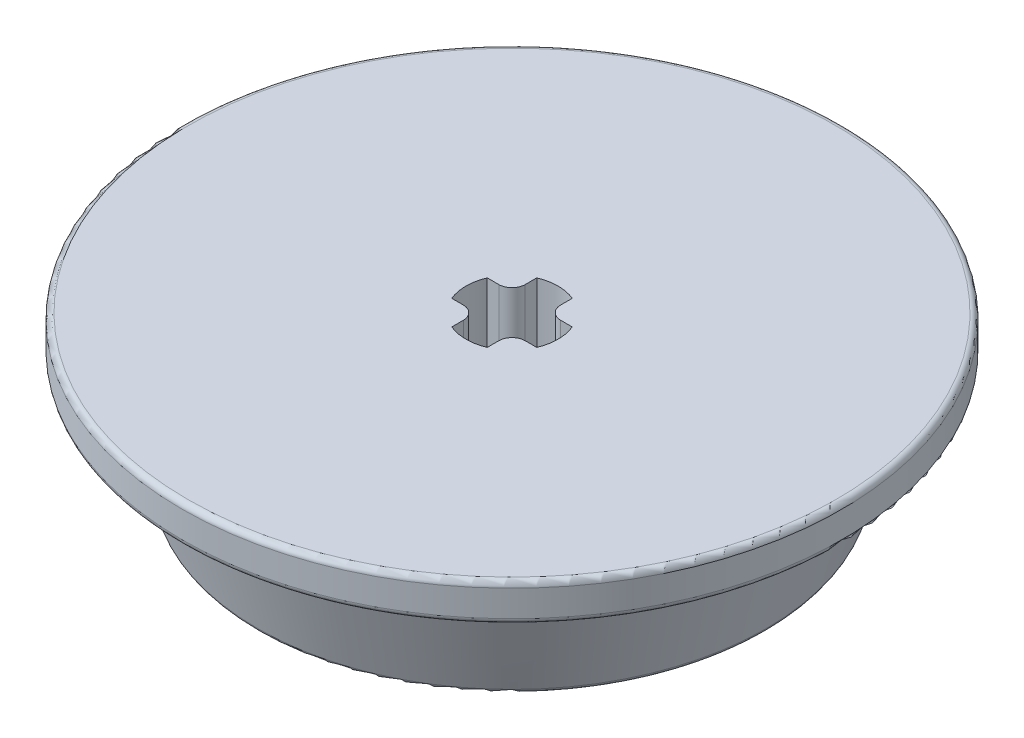
ISO-10303-21;
HEADER;
FILE_DESCRIPTION(('STEP AP214'),'2;1');
FILE_NAME('part.step','',(''),(''),'','','');
FILE_SCHEMA(('AUTOMOTIVE_DESIGN { 1 0 10303 214 1 1 1 1 }'));
ENDSEC;
DATA;
#1=APPLICATION_CONTEXT('core data for automotive mechanical design processes');
#2=APPLICATION_PROTOCOL_DEFINITION('international standard','automotive_design',2000,#1);
#3=PRODUCT_CONTEXT('',#1,'mechanical');
#4=PRODUCT('Part','Part','',(#3));
#5=PRODUCT_RELATED_PRODUCT_CATEGORY('part','',(#4));
#6=PRODUCT_DEFINITION_FORMATION('','',#4);
#7=PRODUCT_DEFINITION_CONTEXT('part definition',#1,'design');
#8=PRODUCT_DEFINITION('design','',#6,#7);
#9=PRODUCT_DEFINITION_SHAPE('','',#8);
#10=(LENGTH_UNIT() NAMED_UNIT(*) SI_UNIT(.MILLI.,.METRE.));
#11=(NAMED_UNIT(*) PLANE_ANGLE_UNIT() SI_UNIT($,.RADIAN.));
#12=(NAMED_UNIT(*) SI_UNIT($,.STERADIAN.) SOLID_ANGLE_UNIT());
#13=UNCERTAINTY_MEASURE_WITH_UNIT(LENGTH_MEASURE(1.E-05),#10,'distance_accuracy_value','');
#14=(GEOMETRIC_REPRESENTATION_CONTEXT(3) GLOBAL_UNCERTAINTY_ASSIGNED_CONTEXT((#13)) GLOBAL_UNIT_ASSIGNED_CONTEXT((#10,
#11,#12)) REPRESENTATION_CONTEXT('',''));
#15=CARTESIAN_POINT('',(0.,0.,0.));
#16=DIRECTION('',(0.,0.,1.));
#17=DIRECTION('',(1.,0.,0.));
#18=AXIS2_PLACEMENT_3D('',#15,#16,#17);
#19=CARTESIAN_POINT('',(0.,0.,0.));
#20=DIRECTION('',(0.,1.,0.));
#21=DIRECTION('',(0.,0.,1.));
#22=AXIS2_PLACEMENT_3D('',#19,#20,#21);
#23=PLANE('',#22);
#24=CARTESIAN_POINT('',(0.,0.,0.));
#25=DIRECTION('',(0.,1.,0.));
#26=DIRECTION('',(0.,0.,1.));
#27=AXIS2_PLACEMENT_3D('',#24,#25,#26);
#28=CIRCLE('',#27,17.1604709958205);
#29=CARTESIAN_POINT('',(0.,0.,17.1604709958205));
#30=VERTEX_POINT('',#29);
#31=EDGE_CURVE('E293',#30,#30,#28,.T.);
#32=ORIENTED_EDGE('',*,*,#31,.T.);
#33=EDGE_LOOP('',(#32));
#34=FACE_BOUND('',#33,.T.);
#35=DIRECTION('',(0.,0.,1.));
#36=VECTOR('',#35,1.);
#37=CARTESIAN_POINT('',(-0.940000000000001,0.,0.940000000000009));
#38=LINE('',#37,#36);
#39=CARTESIAN_POINT('',(-0.940000000000001,0.,1.64000000000001));
#40=VERTEX_POINT('',#39);
#41=CARTESIAN_POINT('',(-0.94,0.,2.25166604983954));
#42=VERTEX_POINT('',#41);
#43=EDGE_CURVE('E210',#40,#42,#38,.T.);
#44=ORIENTED_EDGE('',*,*,#43,.F.);
#45=CARTESIAN_POINT('',(-1.64,0.,1.64000000000001));
#46=DIRECTION('',(0.,1.,0.));
#47=DIRECTION('',(0.,0.,1.));
#48=AXIS2_PLACEMENT_3D('',#45,#46,#47);
#49=CIRCLE('',#48,0.7);
#50=CARTESIAN_POINT('',(-1.64,0.,0.940000000000009));
#51=VERTEX_POINT('',#50);
#52=EDGE_CURVE('E254',#40,#51,#49,.T.);
#53=ORIENTED_EDGE('',*,*,#52,.T.);
#54=DIRECTION('',(1.,0.,0.));
#55=VECTOR('',#54,1.);
#56=CARTESIAN_POINT('',(-2.25166604983954,0.,0.940000000000009));
#57=LINE('',#56,#55);
#58=CARTESIAN_POINT('',(-2.25166604983954,0.,0.940000000000008));
#59=VERTEX_POINT('',#58);
#60=EDGE_CURVE('E208',#59,#51,#57,.T.);
#61=ORIENTED_EDGE('',*,*,#60,.F.);
#62=CARTESIAN_POINT('',(0.,0.,0.));
#63=DIRECTION('',(0.,1.,0.));
#64=DIRECTION('',(0.,0.,1.));
#65=AXIS2_PLACEMENT_3D('',#62,#63,#64);
#66=CIRCLE('',#65,2.44);
#67=CARTESIAN_POINT('',(-2.25166604983954,0.,-0.940000000000009));
#68=VERTEX_POINT('',#67);
#69=EDGE_CURVE('E160',#68,#59,#66,.T.);
#70=ORIENTED_EDGE('',*,*,#69,.F.);
#71=DIRECTION('',(-1.,0.,0.));
#72=VECTOR('',#71,1.);
#73=CARTESIAN_POINT('',(-0.94,0.,-0.940000000000009));
#74=LINE('',#73,#72);
#75=CARTESIAN_POINT('',(-1.64,0.,-0.940000000000009));
#76=VERTEX_POINT('',#75);
#77=EDGE_CURVE('E205',#76,#68,#74,.T.);
#78=ORIENTED_EDGE('',*,*,#77,.F.);
#79=CARTESIAN_POINT('',(-1.64,0.,-1.64000000000001));
#80=DIRECTION('',(0.,1.,0.));
#81=DIRECTION('',(0.,0.,1.));
#82=AXIS2_PLACEMENT_3D('',#79,#80,#81);
#83=CIRCLE('',#82,0.7);
#84=CARTESIAN_POINT('',(-0.94,0.,-1.64000000000001));
#85=VERTEX_POINT('',#84);
#86=EDGE_CURVE('E248',#76,#85,#83,.T.);
#87=ORIENTED_EDGE('',*,*,#86,.T.);
#88=DIRECTION('',(0.,0.,1.));
#89=VECTOR('',#88,1.);
#90=CARTESIAN_POINT('',(-0.94,0.,-2.25166604983954));
#91=LINE('',#90,#89);
#92=CARTESIAN_POINT('',(-0.940000000000001,0.,-2.25166604983954));
#93=VERTEX_POINT('',#92);
#94=EDGE_CURVE('E202',#93,#85,#91,.T.);
#95=ORIENTED_EDGE('',*,*,#94,.F.);
#96=CARTESIAN_POINT('',(0.,0.,0.));
#97=DIRECTION('',(0.,1.,0.));
#98=DIRECTION('',(0.,0.,-1.));
#99=AXIS2_PLACEMENT_3D('',#96,#97,#98);
#100=CIRCLE('',#99,2.44);
#101=CARTESIAN_POINT('',(0.94,0.,-2.25166604983954));
#102=VERTEX_POINT('',#101);
#103=EDGE_CURVE('E227',#102,#93,#100,.T.);
#104=ORIENTED_EDGE('',*,*,#103,.F.);
#105=DIRECTION('',(0.,0.,-1.));
#106=VECTOR('',#105,1.);
#107=CARTESIAN_POINT('',(0.94,0.,-2.25166604983954));
#108=LINE('',#107,#106);
#109=CARTESIAN_POINT('',(0.94,0.,-1.64));
#110=VERTEX_POINT('',#109);
#111=EDGE_CURVE('E225',#110,#102,#108,.T.);
#112=ORIENTED_EDGE('',*,*,#111,.F.);
#113=CARTESIAN_POINT('',(1.64,0.,-1.64));
#114=DIRECTION('',(0.,1.,0.));
#115=DIRECTION('',(0.,0.,1.));
#116=AXIS2_PLACEMENT_3D('',#113,#114,#115);
#117=CIRCLE('',#116,0.7);
#118=CARTESIAN_POINT('',(1.64,0.,-0.940000000000003));
#119=VERTEX_POINT('',#118);
#120=EDGE_CURVE('E250',#110,#119,#117,.T.);
#121=ORIENTED_EDGE('',*,*,#120,.T.);
#122=DIRECTION('',(-1.,0.,0.));
#123=VECTOR('',#122,1.);
#124=CARTESIAN_POINT('',(0.94,0.,-0.940000000000003));
#125=LINE('',#124,#123);
#126=CARTESIAN_POINT('',(2.25166604983954,0.,-0.940000000000003));
#127=VERTEX_POINT('',#126);
#128=EDGE_CURVE('E223',#127,#119,#125,.T.);
#129=ORIENTED_EDGE('',*,*,#128,.F.);
#130=CARTESIAN_POINT('',(0.,0.,0.));
#131=DIRECTION('',(0.,1.,0.));
#132=DIRECTION('',(0.,0.,-1.));
#133=AXIS2_PLACEMENT_3D('',#130,#131,#132);
#134=CIRCLE('',#133,2.44);
#135=CARTESIAN_POINT('',(2.25166604983954,0.,0.940000000000003));
#136=VERTEX_POINT('',#135);
#137=EDGE_CURVE('E220',#136,#127,#134,.T.);
#138=ORIENTED_EDGE('',*,*,#137,.F.);
#139=DIRECTION('',(1.,0.,0.));
#140=VECTOR('',#139,1.);
#141=CARTESIAN_POINT('',(0.940000000000001,0.,0.940000000000003));
#142=LINE('',#141,#140);
#143=CARTESIAN_POINT('',(1.64,0.,0.940000000000003));
#144=VERTEX_POINT('',#143);
#145=EDGE_CURVE('E218',#144,#136,#142,.T.);
#146=ORIENTED_EDGE('',*,*,#145,.F.);
#147=CARTESIAN_POINT('',(1.64,0.,1.64));
#148=DIRECTION('',(0.,1.,0.));
#149=DIRECTION('',(0.,0.,1.));
#150=AXIS2_PLACEMENT_3D('',#147,#148,#149);
#151=CIRCLE('',#150,0.7);
#152=CARTESIAN_POINT('',(0.940000000000001,0.,1.64));
#153=VERTEX_POINT('',#152);
#154=EDGE_CURVE('E252',#144,#153,#151,.T.);
#155=ORIENTED_EDGE('',*,*,#154,.T.);
#156=DIRECTION('',(0.,0.,-1.));
#157=VECTOR('',#156,1.);
#158=CARTESIAN_POINT('',(0.940000000000001,0.,2.25166604983954));
#159=LINE('',#158,#157);
#160=CARTESIAN_POINT('',(0.94,0.,2.25166604983954));
#161=VERTEX_POINT('',#160);
#162=EDGE_CURVE('E215',#161,#153,#159,.T.);
#163=ORIENTED_EDGE('',*,*,#162,.F.);
#164=CARTESIAN_POINT('',(0.,0.,0.));
#165=DIRECTION('',(0.,1.,0.));
#166=DIRECTION('',(0.,0.,1.));
#167=AXIS2_PLACEMENT_3D('',#164,#165,#166);
#168=CIRCLE('',#167,2.44);
#169=EDGE_CURVE('E212',#42,#161,#168,.T.);
#170=ORIENTED_EDGE('',*,*,#169,.F.);
#171=EDGE_LOOP('',(#44,#53,#61,#70,#78,#87,#95,#104,#112,#121,#129,#138,#146,#155,#163,#170));
#172=FACE_BOUND('',#171,.T.);
#173=ADVANCED_FACE('F37',(#34,#172),#23,.T.);
#174=CARTESIAN_POINT('',(0.,0.,0.));
#175=DIRECTION('',(0.,-1.,0.));
#176=DIRECTION('',(0.,0.,-1.));
#177=AXIS2_PLACEMENT_3D('',#174,#175,#176);
#178=CYLINDRICAL_SURFACE('',#177,17.4604709958205);
#179=CARTESIAN_POINT('',(0.,-0.3,0.));
#180=DIRECTION('',(0.,1.,0.));
#181=DIRECTION('',(0.,0.,1.));
#182=AXIS2_PLACEMENT_3D('',#179,#180,#181);
#183=CIRCLE('',#182,17.4604709958205);
#184=CARTESIAN_POINT('',(0.,-0.3,17.4604709958205));
#185=VERTEX_POINT('',#184);
#186=EDGE_CURVE('E290',#185,#185,#183,.F.);
#187=ORIENTED_EDGE('',*,*,#186,.T.);
#188=EDGE_LOOP('',(#187));
#189=FACE_BOUND('',#188,.T.);
#190=CARTESIAN_POINT('',(0.,-1.7,0.));
#191=DIRECTION('',(0.,-1.,0.));
#192=DIRECTION('',(0.,0.,-1.));
#193=AXIS2_PLACEMENT_3D('',#190,#191,#192);
#194=CIRCLE('',#193,17.4604709958205);
#195=CARTESIAN_POINT('',(0.,-1.7,-17.4604709958205));
#196=VERTEX_POINT('',#195);
#197=EDGE_CURVE('E287',#196,#196,#194,.F.);
#198=ORIENTED_EDGE('',*,*,#197,.T.);
#199=EDGE_LOOP('',(#198));
#200=FACE_BOUND('',#199,.T.);
#201=ADVANCED_FACE('F310',(#189,#200),#178,.T.);
#202=CARTESIAN_POINT('',(17.4604709958205,-2.,0.));
#203=DIRECTION('',(0.,-1.,0.));
#204=DIRECTION('',(0.,0.,-1.));
#205=AXIS2_PLACEMENT_3D('',#202,#203,#204);
#206=PLANE('',#205);
#207=CARTESIAN_POINT('',(0.,-2.,0.));
#208=DIRECTION('',(0.,-1.,0.));
#209=DIRECTION('',(0.,0.,-1.));
#210=AXIS2_PLACEMENT_3D('',#207,#208,#209);
#211=CIRCLE('',#210,15.230198096394);
#212=CARTESIAN_POINT('',(0.,-2.,-15.230198096394));
#213=VERTEX_POINT('',#212);
#214=EDGE_CURVE('E11',#213,#213,#211,.F.);
#215=ORIENTED_EDGE('',*,*,#214,.T.);
#216=EDGE_LOOP('',(#215));
#217=FACE_BOUND('',#216,.T.);
#218=CARTESIAN_POINT('',(0.,-2.,0.));
#219=DIRECTION('',(0.,-1.,0.));
#220=DIRECTION('',(0.,0.,-1.));
#221=AXIS2_PLACEMENT_3D('',#218,#219,#220);
#222=CIRCLE('',#221,17.1604709958205);
#223=CARTESIAN_POINT('',(0.,-2.,-17.1604709958205));
#224=VERTEX_POINT('',#223);
#225=EDGE_CURVE('E45',#224,#224,#222,.T.);
#226=ORIENTED_EDGE('',*,*,#225,.T.);
#227=EDGE_LOOP('',(#226));
#228=FACE_BOUND('',#227,.T.);
#229=ADVANCED_FACE('F298',(#217,#228),#206,.T.);
#230=CARTESIAN_POINT('',(0.,-8.,0.));
#231=DIRECTION('',(0.,1.,0.));
#232=DIRECTION('',(0.,0.,1.));
#233=AXIS2_PLACEMENT_3D('',#230,#231,#232);
#234=CONICAL_SURFACE('',#233,13.3923048454231,0.261799387797619);
#235=CARTESIAN_POINT('',(0.,-7.7776457135303,0.));
#236=DIRECTION('',(0.,-1.,0.));
#237=DIRECTION('',(0.,0.,-1.));
#238=AXIS2_PLACEMENT_3D('',#235,#236,#237);
#239=CIRCLE('',#238,13.4518844969159);
#240=CARTESIAN_POINT('',(0.,-7.7776457135303,-13.4518844969159));
#241=VERTEX_POINT('',#240);
#242=EDGE_CURVE('E284',#241,#241,#239,.F.);
#243=ORIENTED_EDGE('',*,*,#242,.T.);
#244=EDGE_LOOP('',(#243));
#245=FACE_BOUND('',#244,.T.);
#246=CARTESIAN_POINT('',(0.,-2.22235428646969,0.));
#247=DIRECTION('',(0.,1.,0.));
#248=DIRECTION('',(0.,0.,1.));
#249=AXIS2_PLACEMENT_3D('',#246,#247,#248);
#250=CIRCLE('',#249,14.9404203485072);
#251=CARTESIAN_POINT('',(0.,-2.22235428646969,14.9404203485072));
#252=VERTEX_POINT('',#251);
#253=EDGE_CURVE('E281',#252,#252,#250,.F.);
#254=ORIENTED_EDGE('',*,*,#253,.T.);
#255=EDGE_LOOP('',(#254));
#256=FACE_BOUND('',#255,.T.);
#257=ADVANCED_FACE('F520',(#245,#256),#234,.T.);
#258=CARTESIAN_POINT('',(13.3923048454231,-8.,0.));
#259=DIRECTION('',(0.,-1.,0.));
#260=DIRECTION('',(0.,0.,-1.));
#261=AXIS2_PLACEMENT_3D('',#258,#259,#260);
#262=PLANE('',#261);
#263=CARTESIAN_POINT('',(0.,-8.,0.));
#264=DIRECTION('',(0.,-1.,0.));
#265=DIRECTION('',(0.,0.,-1.));
#266=AXIS2_PLACEMENT_3D('',#263,#264,#265);
#267=CIRCLE('',#266,13.1621067490291);
#268=CARTESIAN_POINT('',(0.,-8.,-13.1621067490291));
#269=VERTEX_POINT('',#268);
#270=EDGE_CURVE('E278',#269,#269,#267,.T.);
#271=ORIENTED_EDGE('',*,*,#270,.T.);
#272=EDGE_LOOP('',(#271));
#273=FACE_BOUND('',#272,.T.);
#274=DIRECTION('',(1.,0.,0.));
#275=VECTOR('',#274,1.);
#276=CARTESIAN_POINT('',(-2.25166604983954,-8.,0.940000000000009));
#277=LINE('',#276,#275);
#278=CARTESIAN_POINT('',(-2.25166604983954,-8.,0.940000000000008));
#279=VERTEX_POINT('',#278);
#280=CARTESIAN_POINT('',(-1.64,-8.,0.940000000000009));
#281=VERTEX_POINT('',#280);
#282=EDGE_CURVE('E168',#279,#281,#277,.T.);
#283=ORIENTED_EDGE('',*,*,#282,.T.);
#284=CARTESIAN_POINT('',(-1.64,-8.,1.64000000000001));
#285=DIRECTION('',(0.,-1.,0.));
#286=DIRECTION('',(0.,0.,-1.));
#287=AXIS2_PLACEMENT_3D('',#284,#285,#286);
#288=CIRCLE('',#287,0.7);
#289=CARTESIAN_POINT('',(-0.940000000000001,-8.,1.64000000000001));
#290=VERTEX_POINT('',#289);
#291=EDGE_CURVE('E262',#281,#290,#288,.T.);
#292=ORIENTED_EDGE('',*,*,#291,.T.);
#293=DIRECTION('',(0.,0.,1.));
#294=VECTOR('',#293,1.);
#295=CARTESIAN_POINT('',(-0.940000000000001,-8.,0.940000000000009));
#296=LINE('',#295,#294);
#297=CARTESIAN_POINT('',(-0.94,-8.,2.25166604983954));
#298=VERTEX_POINT('',#297);
#299=EDGE_CURVE('E173',#290,#298,#296,.T.);
#300=ORIENTED_EDGE('',*,*,#299,.T.);
#301=CARTESIAN_POINT('',(0.,-8.,0.));
#302=DIRECTION('',(0.,1.,0.));
#303=DIRECTION('',(0.,0.,1.));
#304=AXIS2_PLACEMENT_3D('',#301,#302,#303);
#305=CIRCLE('',#304,2.44);
#306=CARTESIAN_POINT('',(0.94,-8.,2.25166604983954));
#307=VERTEX_POINT('',#306);
#308=EDGE_CURVE('E184',#298,#307,#305,.T.);
#309=ORIENTED_EDGE('',*,*,#308,.T.);
#310=DIRECTION('',(0.,0.,-1.));
#311=VECTOR('',#310,1.);
#312=CARTESIAN_POINT('',(0.940000000000001,-8.,2.25166604983954));
#313=LINE('',#312,#311);
#314=CARTESIAN_POINT('',(0.940000000000001,-8.,1.64));
#315=VERTEX_POINT('',#314);
#316=EDGE_CURVE('E187',#307,#315,#313,.T.);
#317=ORIENTED_EDGE('',*,*,#316,.T.);
#318=CARTESIAN_POINT('',(1.64,-8.,1.64));
#319=DIRECTION('',(0.,-1.,0.));
#320=DIRECTION('',(0.,0.,-1.));
#321=AXIS2_PLACEMENT_3D('',#318,#319,#320);
#322=CIRCLE('',#321,0.7);
#323=CARTESIAN_POINT('',(1.64,-8.,0.940000000000003));
#324=VERTEX_POINT('',#323);
#325=EDGE_CURVE('E260',#315,#324,#322,.T.);
#326=ORIENTED_EDGE('',*,*,#325,.T.);
#327=DIRECTION('',(1.,0.,0.));
#328=VECTOR('',#327,1.);
#329=CARTESIAN_POINT('',(0.940000000000001,-8.,0.940000000000003));
#330=LINE('',#329,#328);
#331=CARTESIAN_POINT('',(2.25166604983954,-8.,0.940000000000003));
#332=VERTEX_POINT('',#331);
#333=EDGE_CURVE('E190',#324,#332,#330,.T.);
#334=ORIENTED_EDGE('',*,*,#333,.T.);
#335=CARTESIAN_POINT('',(0.,-8.,0.));
#336=DIRECTION('',(0.,1.,0.));
#337=DIRECTION('',(0.,0.,-1.));
#338=AXIS2_PLACEMENT_3D('',#335,#336,#337);
#339=CIRCLE('',#338,2.44);
#340=CARTESIAN_POINT('',(2.25166604983954,-8.,-0.940000000000003));
#341=VERTEX_POINT('',#340);
#342=EDGE_CURVE('E192',#332,#341,#339,.T.);
#343=ORIENTED_EDGE('',*,*,#342,.T.);
#344=DIRECTION('',(-1.,0.,0.));
#345=VECTOR('',#344,1.);
#346=CARTESIAN_POINT('',(0.94,-8.,-0.940000000000003));
#347=LINE('',#346,#345);
#348=CARTESIAN_POINT('',(1.64,-8.,-0.940000000000003));
#349=VERTEX_POINT('',#348);
#350=EDGE_CURVE('E195',#341,#349,#347,.T.);
#351=ORIENTED_EDGE('',*,*,#350,.T.);
#352=CARTESIAN_POINT('',(1.64,-8.,-1.64));
#353=DIRECTION('',(0.,-1.,0.));
#354=DIRECTION('',(0.,0.,-1.));
#355=AXIS2_PLACEMENT_3D('',#352,#353,#354);
#356=CIRCLE('',#355,0.7);
#357=CARTESIAN_POINT('',(0.94,-8.,-1.64));
#358=VERTEX_POINT('',#357);
#359=EDGE_CURVE('E52',#349,#358,#356,.T.);
#360=ORIENTED_EDGE('',*,*,#359,.T.);
#361=DIRECTION('',(0.,0.,-1.));
#362=VECTOR('',#361,1.);
#363=CARTESIAN_POINT('',(0.94,-8.,-2.25166604983954));
#364=LINE('',#363,#362);
#365=CARTESIAN_POINT('',(0.94,-8.,-2.25166604983954));
#366=VERTEX_POINT('',#365);
#367=EDGE_CURVE('E197',#358,#366,#364,.T.);
#368=ORIENTED_EDGE('',*,*,#367,.T.);
#369=CARTESIAN_POINT('',(0.,-8.,0.));
#370=DIRECTION('',(0.,1.,0.));
#371=DIRECTION('',(0.,0.,-1.));
#372=AXIS2_PLACEMENT_3D('',#369,#370,#371);
#373=CIRCLE('',#372,2.44);
#374=CARTESIAN_POINT('',(-0.940000000000001,-8.,-2.25166604983954));
#375=VERTEX_POINT('',#374);
#376=EDGE_CURVE('E199',#366,#375,#373,.T.);
#377=ORIENTED_EDGE('',*,*,#376,.T.);
#378=DIRECTION('',(0.,0.,1.));
#379=VECTOR('',#378,1.);
#380=CARTESIAN_POINT('',(-0.94,-8.,-2.25166604983954));
#381=LINE('',#380,#379);
#382=CARTESIAN_POINT('',(-0.94,-8.,-1.64000000000001));
#383=VERTEX_POINT('',#382);
#384=EDGE_CURVE('E179',#375,#383,#381,.T.);
#385=ORIENTED_EDGE('',*,*,#384,.T.);
#386=CARTESIAN_POINT('',(-1.64,-8.,-1.64000000000001));
#387=DIRECTION('',(0.,-1.,0.));
#388=DIRECTION('',(0.,0.,-1.));
#389=AXIS2_PLACEMENT_3D('',#386,#387,#388);
#390=CIRCLE('',#389,0.7);
#391=CARTESIAN_POINT('',(-1.64,-8.,-0.940000000000009));
#392=VERTEX_POINT('',#391);
#393=EDGE_CURVE('E257',#383,#392,#390,.T.);
#394=ORIENTED_EDGE('',*,*,#393,.T.);
#395=DIRECTION('',(-1.,0.,0.));
#396=VECTOR('',#395,1.);
#397=CARTESIAN_POINT('',(-0.94,-8.,-0.940000000000009));
#398=LINE('',#397,#396);
#399=CARTESIAN_POINT('',(-2.25166604983953,-8.,-0.940000000000009));
#400=VERTEX_POINT('',#399);
#401=EDGE_CURVE('E177',#392,#400,#398,.T.);
#402=ORIENTED_EDGE('',*,*,#401,.T.);
#403=CARTESIAN_POINT('',(0.,-8.,0.));
#404=DIRECTION('',(0.,1.,0.));
#405=DIRECTION('',(0.,0.,1.));
#406=AXIS2_PLACEMENT_3D('',#403,#404,#405);
#407=CIRCLE('',#406,2.44);
#408=EDGE_CURVE('E157',#400,#279,#407,.T.);
#409=ORIENTED_EDGE('',*,*,#408,.T.);
#410=EDGE_LOOP('',(#283,#292,#300,#309,#317,#326,#334,#343,#351,#360,#368,#377,#385,#394,#402,#409));
#411=FACE_BOUND('',#410,.T.);
#412=ADVANCED_FACE('F175',(#273,#411),#262,.T.);
#413=CARTESIAN_POINT('',(-0.94,-8.,-2.25166604983954));
#414=DIRECTION('',(-1.,0.,0.));
#415=DIRECTION('',(0.,0.,1.));
#416=AXIS2_PLACEMENT_3D('',#413,#414,#415);
#417=PLANE('',#416);
#418=ORIENTED_EDGE('',*,*,#94,.T.);
#419=DIRECTION('',(0.,1.,0.));
#420=VECTOR('',#419,1.);
#421=CARTESIAN_POINT('',(-0.94,-8.,-1.64000000000001));
#422=LINE('',#421,#420);
#423=EDGE_CURVE('E276',#85,#383,#422,.F.);
#424=ORIENTED_EDGE('',*,*,#423,.T.);
#425=ORIENTED_EDGE('',*,*,#384,.F.);
#426=DIRECTION('',(0.,1.,0.));
#427=VECTOR('',#426,1.);
#428=CARTESIAN_POINT('',(-0.940000000000001,-8.,-2.25166604983954));
#429=LINE('',#428,#427);
#430=EDGE_CURVE('E230',#375,#93,#429,.T.);
#431=ORIENTED_EDGE('',*,*,#430,.T.);
#432=EDGE_LOOP('',(#418,#424,#425,#431));
#433=FACE_BOUND('',#432,.T.);
#434=ADVANCED_FACE('F501',(#433),#417,.F.);
#435=CARTESIAN_POINT('',(0.,-8.,0.));
#436=DIRECTION('',(0.,1.,0.));
#437=DIRECTION('',(0.,0.,1.));
#438=AXIS2_PLACEMENT_3D('',#435,#436,#437);
#439=CYLINDRICAL_SURFACE('',#438,2.44);
#440=ORIENTED_EDGE('',*,*,#103,.T.);
#441=ORIENTED_EDGE('',*,*,#430,.F.);
#442=ORIENTED_EDGE('',*,*,#376,.F.);
#443=DIRECTION('',(0.,1.,0.));
#444=VECTOR('',#443,1.);
#445=CARTESIAN_POINT('',(0.94,-8.,-2.25166604983954));
#446=LINE('',#445,#444);
#447=EDGE_CURVE('E233',#366,#102,#446,.T.);
#448=ORIENTED_EDGE('',*,*,#447,.T.);
#449=EDGE_LOOP('',(#440,#441,#442,#448));
#450=FACE_BOUND('',#449,.T.);
#451=ADVANCED_FACE('F491',(#450),#439,.F.);
#452=CARTESIAN_POINT('',(0.94,-8.,-2.25166604983954));
#453=DIRECTION('',(1.,0.,0.));
#454=DIRECTION('',(0.,0.,-1.));
#455=AXIS2_PLACEMENT_3D('',#452,#453,#454);
#456=PLANE('',#455);
#457=ORIENTED_EDGE('',*,*,#367,.F.);
#458=DIRECTION('',(0.,1.,0.));
#459=VECTOR('',#458,1.);
#460=CARTESIAN_POINT('',(0.94,-8.,-1.64));
#461=LINE('',#460,#459);
#462=EDGE_CURVE('E269',#358,#110,#461,.T.);
#463=ORIENTED_EDGE('',*,*,#462,.T.);
#464=ORIENTED_EDGE('',*,*,#111,.T.);
#465=ORIENTED_EDGE('',*,*,#447,.F.);
#466=EDGE_LOOP('',(#457,#463,#464,#465));
#467=FACE_BOUND('',#466,.T.);
#468=ADVANCED_FACE('F482',(#467),#456,.F.);
#469=CARTESIAN_POINT('',(0.94,-8.,-0.940000000000003));
#470=DIRECTION('',(0.,0.,-1.));
#471=DIRECTION('',(-1.,0.,0.));
#472=AXIS2_PLACEMENT_3D('',#469,#470,#471);
#473=PLANE('',#472);
#474=ORIENTED_EDGE('',*,*,#128,.T.);
#475=DIRECTION('',(0.,1.,0.));
#476=VECTOR('',#475,1.);
#477=CARTESIAN_POINT('',(1.64,-8.,-0.940000000000003));
#478=LINE('',#477,#476);
#479=EDGE_CURVE('E60',#119,#349,#478,.F.);
#480=ORIENTED_EDGE('',*,*,#479,.T.);
#481=ORIENTED_EDGE('',*,*,#350,.F.);
#482=DIRECTION('',(0.,1.,0.));
#483=VECTOR('',#482,1.);
#484=CARTESIAN_POINT('',(2.25166604983954,-8.,-0.940000000000003));
#485=LINE('',#484,#483);
#486=EDGE_CURVE('E236',#341,#127,#485,.T.);
#487=ORIENTED_EDGE('',*,*,#486,.T.);
#488=EDGE_LOOP('',(#474,#480,#481,#487));
#489=FACE_BOUND('',#488,.T.);
#490=ADVANCED_FACE('F472',(#489),#473,.F.);
#491=CARTESIAN_POINT('',(0.,-8.,0.));
#492=DIRECTION('',(0.,1.,0.));
#493=DIRECTION('',(0.,0.,1.));
#494=AXIS2_PLACEMENT_3D('',#491,#492,#493);
#495=CYLINDRICAL_SURFACE('',#494,2.44);
#496=ORIENTED_EDGE('',*,*,#137,.T.);
#497=ORIENTED_EDGE('',*,*,#486,.F.);
#498=ORIENTED_EDGE('',*,*,#342,.F.);
#499=DIRECTION('',(0.,1.,0.));
#500=VECTOR('',#499,1.);
#501=CARTESIAN_POINT('',(2.25166604983954,-8.,0.940000000000003));
#502=LINE('',#501,#500);
#503=EDGE_CURVE('E238',#332,#136,#502,.T.);
#504=ORIENTED_EDGE('',*,*,#503,.T.);
#505=EDGE_LOOP('',(#496,#497,#498,#504));
#506=FACE_BOUND('',#505,.T.);
#507=ADVANCED_FACE('F462',(#506),#495,.F.);
#508=CARTESIAN_POINT('',(0.940000000000001,-8.,0.940000000000003));
#509=DIRECTION('',(0.,0.,1.));
#510=DIRECTION('',(1.,0.,0.));
#511=AXIS2_PLACEMENT_3D('',#508,#509,#510);
#512=PLANE('',#511);
#513=ORIENTED_EDGE('',*,*,#333,.F.);
#514=DIRECTION('',(0.,1.,0.));
#515=VECTOR('',#514,1.);
#516=CARTESIAN_POINT('',(1.64,-8.,0.940000000000003));
#517=LINE('',#516,#515);
#518=EDGE_CURVE('E264',#324,#144,#517,.T.);
#519=ORIENTED_EDGE('',*,*,#518,.T.);
#520=ORIENTED_EDGE('',*,*,#145,.T.);
#521=ORIENTED_EDGE('',*,*,#503,.F.);
#522=EDGE_LOOP('',(#513,#519,#520,#521));
#523=FACE_BOUND('',#522,.T.);
#524=ADVANCED_FACE('F452',(#523),#512,.F.);
#525=CARTESIAN_POINT('',(0.940000000000001,-8.,2.25166604983954));
#526=DIRECTION('',(1.,0.,0.));
#527=DIRECTION('',(0.,0.,-1.));
#528=AXIS2_PLACEMENT_3D('',#525,#526,#527);
#529=PLANE('',#528);
#530=ORIENTED_EDGE('',*,*,#162,.T.);
#531=DIRECTION('',(0.,1.,0.));
#532=VECTOR('',#531,1.);
#533=CARTESIAN_POINT('',(0.940000000000001,-8.,1.64));
#534=LINE('',#533,#532);
#535=EDGE_CURVE('E267',#153,#315,#534,.F.);
#536=ORIENTED_EDGE('',*,*,#535,.T.);
#537=ORIENTED_EDGE('',*,*,#316,.F.);
#538=DIRECTION('',(0.,1.,0.));
#539=VECTOR('',#538,1.);
#540=CARTESIAN_POINT('',(0.94,-8.,2.25166604983954));
#541=LINE('',#540,#539);
#542=EDGE_CURVE('E241',#307,#161,#541,.T.);
#543=ORIENTED_EDGE('',*,*,#542,.T.);
#544=EDGE_LOOP('',(#530,#536,#537,#543));
#545=FACE_BOUND('',#544,.T.);
#546=ADVANCED_FACE('F442',(#545),#529,.F.);
#547=CARTESIAN_POINT('',(0.,-8.,0.));
#548=DIRECTION('',(0.,1.,0.));
#549=DIRECTION('',(0.,0.,1.));
#550=AXIS2_PLACEMENT_3D('',#547,#548,#549);
#551=CYLINDRICAL_SURFACE('',#550,2.44);
#552=ORIENTED_EDGE('',*,*,#169,.T.);
#553=ORIENTED_EDGE('',*,*,#542,.F.);
#554=ORIENTED_EDGE('',*,*,#308,.F.);
#555=DIRECTION('',(0.,1.,0.));
#556=VECTOR('',#555,1.);
#557=CARTESIAN_POINT('',(-0.94,-8.,2.25166604983954));
#558=LINE('',#557,#556);
#559=EDGE_CURVE('E164',#298,#42,#558,.T.);
#560=ORIENTED_EDGE('',*,*,#559,.T.);
#561=EDGE_LOOP('',(#552,#553,#554,#560));
#562=FACE_BOUND('',#561,.T.);
#563=ADVANCED_FACE('F432',(#562),#551,.F.);
#564=CARTESIAN_POINT('',(-0.940000000000001,-8.,0.940000000000009));
#565=DIRECTION('',(-1.,0.,0.));
#566=DIRECTION('',(0.,0.,1.));
#567=AXIS2_PLACEMENT_3D('',#564,#565,#566);
#568=PLANE('',#567);
#569=ORIENTED_EDGE('',*,*,#299,.F.);
#570=DIRECTION('',(0.,1.,0.));
#571=VECTOR('',#570,1.);
#572=CARTESIAN_POINT('',(-0.940000000000001,-8.,1.64000000000001));
#573=LINE('',#572,#571);
#574=EDGE_CURVE('E232',#290,#40,#573,.T.);
#575=ORIENTED_EDGE('',*,*,#574,.T.);
#576=ORIENTED_EDGE('',*,*,#43,.T.);
#577=ORIENTED_EDGE('',*,*,#559,.F.);
#578=EDGE_LOOP('',(#569,#575,#576,#577));
#579=FACE_BOUND('',#578,.T.);
#580=ADVANCED_FACE('F423',(#579),#568,.F.);
#581=CARTESIAN_POINT('',(-2.25166604983954,-8.,0.940000000000009));
#582=DIRECTION('',(0.,0.,1.));
#583=DIRECTION('',(1.,0.,0.));
#584=AXIS2_PLACEMENT_3D('',#581,#582,#583);
#585=PLANE('',#584);
#586=ORIENTED_EDGE('',*,*,#60,.T.);
#587=DIRECTION('',(0.,1.,0.));
#588=VECTOR('',#587,1.);
#589=CARTESIAN_POINT('',(-1.64,-8.,0.940000000000009));
#590=LINE('',#589,#588);
#591=EDGE_CURVE('E171',#51,#281,#590,.F.);
#592=ORIENTED_EDGE('',*,*,#591,.T.);
#593=ORIENTED_EDGE('',*,*,#282,.F.);
#594=DIRECTION('',(0.,1.,0.));
#595=VECTOR('',#594,1.);
#596=CARTESIAN_POINT('',(-2.25166604983954,-8.,0.940000000000008));
#597=LINE('',#596,#595);
#598=EDGE_CURVE('E152',#279,#59,#597,.T.);
#599=ORIENTED_EDGE('',*,*,#598,.T.);
#600=EDGE_LOOP('',(#586,#592,#593,#599));
#601=FACE_BOUND('',#600,.T.);
#602=ADVANCED_FACE('F169',(#601),#585,.F.);
#603=CARTESIAN_POINT('',(0.,-8.,0.));
#604=DIRECTION('',(0.,1.,0.));
#605=DIRECTION('',(0.,0.,1.));
#606=AXIS2_PLACEMENT_3D('',#603,#604,#605);
#607=CYLINDRICAL_SURFACE('',#606,2.44);
#608=ORIENTED_EDGE('',*,*,#69,.T.);
#609=ORIENTED_EDGE('',*,*,#598,.F.);
#610=ORIENTED_EDGE('',*,*,#408,.F.);
#611=DIRECTION('',(0.,1.,0.));
#612=VECTOR('',#611,1.);
#613=CARTESIAN_POINT('',(-2.25166604983954,-8.,-0.940000000000009));
#614=LINE('',#613,#612);
#615=EDGE_CURVE('E165',#400,#68,#614,.T.);
#616=ORIENTED_EDGE('',*,*,#615,.T.);
#617=EDGE_LOOP('',(#608,#609,#610,#616));
#618=FACE_BOUND('',#617,.T.);
#619=ADVANCED_FACE('F154',(#618),#607,.F.);
#620=CARTESIAN_POINT('',(-0.94,-8.,-0.940000000000009));
#621=DIRECTION('',(0.,0.,-1.));
#622=DIRECTION('',(-1.,0.,0.));
#623=AXIS2_PLACEMENT_3D('',#620,#621,#622);
#624=PLANE('',#623);
#625=ORIENTED_EDGE('',*,*,#401,.F.);
#626=DIRECTION('',(0.,1.,0.));
#627=VECTOR('',#626,1.);
#628=CARTESIAN_POINT('',(-1.64,-8.,-0.940000000000009));
#629=LINE('',#628,#627);
#630=EDGE_CURVE('E273',#392,#76,#629,.T.);
#631=ORIENTED_EDGE('',*,*,#630,.T.);
#632=ORIENTED_EDGE('',*,*,#77,.T.);
#633=ORIENTED_EDGE('',*,*,#615,.F.);
#634=EDGE_LOOP('',(#625,#631,#632,#633));
#635=FACE_BOUND('',#634,.T.);
#636=ADVANCED_FACE('F325',(#635),#624,.F.);
#637=CARTESIAN_POINT('',(-1.64,-8.,1.64000000000001));
#638=DIRECTION('',(0.,1.,0.));
#639=DIRECTION('',(0.,0.,1.));
#640=AXIS2_PLACEMENT_3D('',#637,#638,#639);
#641=CYLINDRICAL_SURFACE('',#640,0.7);
#642=ORIENTED_EDGE('',*,*,#291,.F.);
#643=ORIENTED_EDGE('',*,*,#591,.F.);
#644=ORIENTED_EDGE('',*,*,#52,.F.);
#645=ORIENTED_EDGE('',*,*,#574,.F.);
#646=EDGE_LOOP('',(#642,#643,#644,#645));
#647=FACE_BOUND('',#646,.T.);
#648=ADVANCED_FACE('F321',(#647),#641,.T.);
#649=CARTESIAN_POINT('',(1.64,-8.,1.64));
#650=DIRECTION('',(0.,1.,0.));
#651=DIRECTION('',(0.,0.,1.));
#652=AXIS2_PLACEMENT_3D('',#649,#650,#651);
#653=CYLINDRICAL_SURFACE('',#652,0.7);
#654=ORIENTED_EDGE('',*,*,#325,.F.);
#655=ORIENTED_EDGE('',*,*,#535,.F.);
#656=ORIENTED_EDGE('',*,*,#154,.F.);
#657=ORIENTED_EDGE('',*,*,#518,.F.);
#658=EDGE_LOOP('',(#654,#655,#656,#657));
#659=FACE_BOUND('',#658,.T.);
#660=ADVANCED_FACE('F324',(#659),#653,.T.);
#661=CARTESIAN_POINT('',(1.64,-8.,-1.64));
#662=DIRECTION('',(0.,1.,0.));
#663=DIRECTION('',(0.,0.,1.));
#664=AXIS2_PLACEMENT_3D('',#661,#662,#663);
#665=CYLINDRICAL_SURFACE('',#664,0.7);
#666=ORIENTED_EDGE('',*,*,#359,.F.);
#667=ORIENTED_EDGE('',*,*,#479,.F.);
#668=ORIENTED_EDGE('',*,*,#120,.F.);
#669=ORIENTED_EDGE('',*,*,#462,.F.);
#670=EDGE_LOOP('',(#666,#667,#668,#669));
#671=FACE_BOUND('',#670,.T.);
#672=ADVANCED_FACE('F329',(#671),#665,.T.);
#673=CARTESIAN_POINT('',(-1.64,-8.,-1.64000000000001));
#674=DIRECTION('',(0.,1.,0.));
#675=DIRECTION('',(0.,0.,1.));
#676=AXIS2_PLACEMENT_3D('',#673,#674,#675);
#677=CYLINDRICAL_SURFACE('',#676,0.7);
#678=ORIENTED_EDGE('',*,*,#393,.F.);
#679=ORIENTED_EDGE('',*,*,#423,.F.);
#680=ORIENTED_EDGE('',*,*,#86,.F.);
#681=ORIENTED_EDGE('',*,*,#630,.F.);
#682=EDGE_LOOP('',(#678,#679,#680,#681));
#683=FACE_BOUND('',#682,.T.);
#684=ADVANCED_FACE('F333',(#683),#677,.T.);
#685=CARTESIAN_POINT('',(0.,-7.7,0.));
#686=DIRECTION('',(0.,-1.,0.));
#687=DIRECTION('',(0.,0.,-1.));
#688=AXIS2_PLACEMENT_3D('',#685,#686,#687);
#689=TOROIDAL_SURFACE('',#688,13.1621067490291,0.3);
#690=ORIENTED_EDGE('',*,*,#242,.F.);
#691=EDGE_LOOP('',(#690));
#692=FACE_BOUND('',#691,.T.);
#693=ORIENTED_EDGE('',*,*,#270,.F.);
#694=EDGE_LOOP('',(#693));
#695=FACE_BOUND('',#694,.T.);
#696=ADVANCED_FACE('F337',(#692,#695),#689,.T.);
#697=CARTESIAN_POINT('',(0.,-0.3,0.));
#698=DIRECTION('',(0.,1.,0.));
#699=DIRECTION('',(0.,0.,1.));
#700=AXIS2_PLACEMENT_3D('',#697,#698,#699);
#701=TOROIDAL_SURFACE('',#700,17.1604709958205,0.3);
#702=ORIENTED_EDGE('',*,*,#31,.F.);
#703=EDGE_LOOP('',(#702));
#704=FACE_BOUND('',#703,.T.);
#705=ORIENTED_EDGE('',*,*,#186,.F.);
#706=EDGE_LOOP('',(#705));
#707=FACE_BOUND('',#706,.T.);
#708=ADVANCED_FACE('F306',(#704,#707),#701,.T.);
#709=CARTESIAN_POINT('',(0.,-2.3,0.));
#710=DIRECTION('',(0.,-1.,0.));
#711=DIRECTION('',(0.,0.,-1.));
#712=AXIS2_PLACEMENT_3D('',#709,#710,#711);
#713=TOROIDAL_SURFACE('',#712,15.230198096394,0.3);
#714=ORIENTED_EDGE('',*,*,#214,.F.);
#715=EDGE_LOOP('',(#714));
#716=FACE_BOUND('',#715,.T.);
#717=ORIENTED_EDGE('',*,*,#253,.F.);
#718=EDGE_LOOP('',(#717));
#719=FACE_BOUND('',#718,.T.);
#720=ADVANCED_FACE('F301',(#716,#719),#713,.F.);
#721=CARTESIAN_POINT('',(0.,-1.7,0.));
#722=DIRECTION('',(0.,-1.,0.));
#723=DIRECTION('',(0.,0.,-1.));
#724=AXIS2_PLACEMENT_3D('',#721,#722,#723);
#725=TOROIDAL_SURFACE('',#724,17.1604709958205,0.3);
#726=ORIENTED_EDGE('',*,*,#197,.F.);
#727=EDGE_LOOP('',(#726));
#728=FACE_BOUND('',#727,.T.);
#729=ORIENTED_EDGE('',*,*,#225,.F.);
#730=EDGE_LOOP('',(#729));
#731=FACE_BOUND('',#730,.T.);
#732=ADVANCED_FACE('F39',(#728,#731),#725,.T.);
#733=CLOSED_SHELL('',(#173,#201,#229,#257,#412,#434,#451,#468,#490,#507,#524,#546,#563,#580,
#602,#619,#636,#648,#660,#672,#684,#696,#708,#720,#732));
#734=MANIFOLD_SOLID_BREP('B2',#733);
#735=ADVANCED_BREP_SHAPE_REPRESENTATION('',(#18,#734),#14);
#736=SHAPE_DEFINITION_REPRESENTATION(#9,#735);
ENDSEC;
END-ISO-10303-21;
